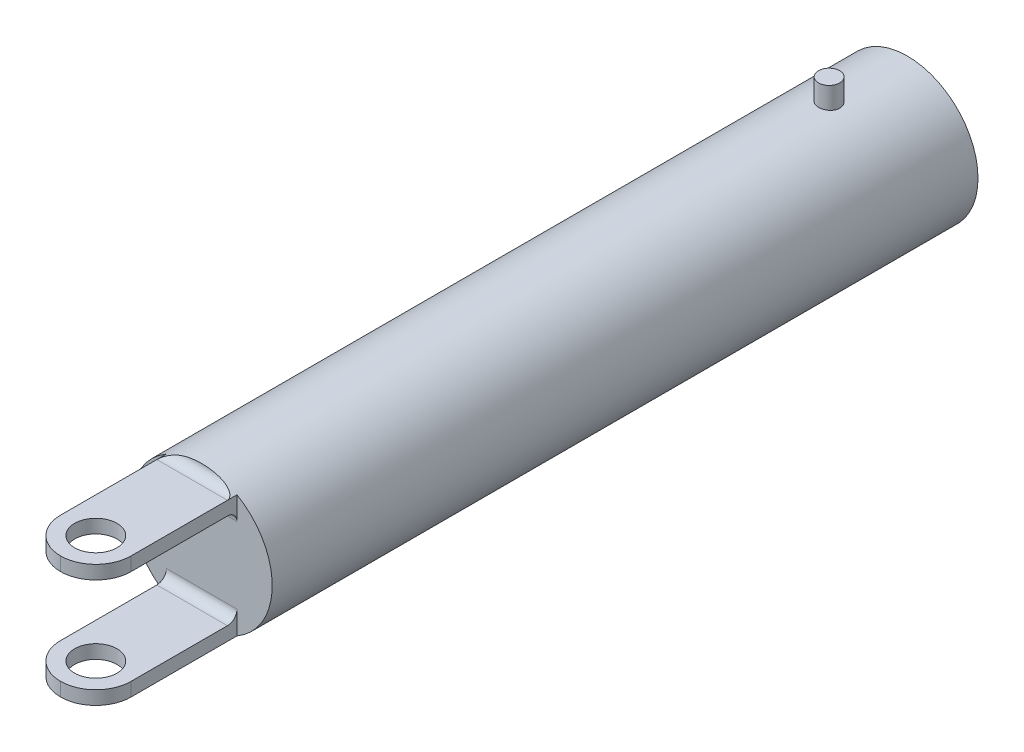
ISO-10303-21;
HEADER;
FILE_DESCRIPTION(('STEP AP214'),'2;1');
FILE_NAME('part.step','',(''),(''),'','','');
FILE_SCHEMA(('AUTOMOTIVE_DESIGN { 1 0 10303 214 1 1 1 1 }'));
ENDSEC;
DATA;
#1=APPLICATION_CONTEXT('core data for automotive mechanical design processes');
#2=APPLICATION_PROTOCOL_DEFINITION('international standard','automotive_design',2000,#1);
#3=PRODUCT_CONTEXT('',#1,'mechanical');
#4=PRODUCT('Part','Part','',(#3));
#5=PRODUCT_RELATED_PRODUCT_CATEGORY('part','',(#4));
#6=PRODUCT_DEFINITION_FORMATION('','',#4);
#7=PRODUCT_DEFINITION_CONTEXT('part definition',#1,'design');
#8=PRODUCT_DEFINITION('design','',#6,#7);
#9=PRODUCT_DEFINITION_SHAPE('','',#8);
#10=(LENGTH_UNIT() NAMED_UNIT(*) SI_UNIT(.MILLI.,.METRE.));
#11=(NAMED_UNIT(*) PLANE_ANGLE_UNIT() SI_UNIT($,.RADIAN.));
#12=(NAMED_UNIT(*) SI_UNIT($,.STERADIAN.) SOLID_ANGLE_UNIT());
#13=UNCERTAINTY_MEASURE_WITH_UNIT(LENGTH_MEASURE(1.E-05),#10,'distance_accuracy_value','');
#14=(GEOMETRIC_REPRESENTATION_CONTEXT(3) GLOBAL_UNCERTAINTY_ASSIGNED_CONTEXT((#13)) GLOBAL_UNIT_ASSIGNED_CONTEXT((#10,
#11,#12)) REPRESENTATION_CONTEXT('',''));
#15=CARTESIAN_POINT('',(0.,0.,0.));
#16=DIRECTION('',(0.,0.,1.));
#17=DIRECTION('',(1.,0.,0.));
#18=AXIS2_PLACEMENT_3D('',#15,#16,#17);
#19=CARTESIAN_POINT('',(0.,0.,100.));
#20=DIRECTION('',(0.,0.,-1.));
#21=DIRECTION('',(-1.,0.,0.));
#22=AXIS2_PLACEMENT_3D('',#19,#20,#21);
#23=CYLINDRICAL_SURFACE('',#22,10.);
#24=DIRECTION('',(0.,0.,-1.));
#25=VECTOR('',#24,1.);
#26=CARTESIAN_POINT('',(-5.,8.66025403784439,100.));
#27=LINE('',#26,#25);
#28=CARTESIAN_POINT('',(-5.,8.66025403784439,100.));
#29=VERTEX_POINT('',#28);
#30=CARTESIAN_POINT('',(-5.,8.66025403784439,101.349997206585));
#31=VERTEX_POINT('',#30);
#32=EDGE_CURVE('E157',#29,#31,#27,.F.);
#33=ORIENTED_EDGE('',*,*,#32,.T.);
#34=CARTESIAN_POINT('',(-5.,8.66025403784439,101.349997206585));
#35=CARTESIAN_POINT('',(-5.00000322632328,8.66025170389989,101.329827622163));
#36=CARTESIAN_POINT('',(-4.99921630531021,8.66070654381186,101.309669164745));
#37=CARTESIAN_POINT('',(-4.99609899344871,8.66250540092606,101.26952692879));
#38=CARTESIAN_POINT('',(-4.99376977917503,8.66384874031466,101.249543028853));
#39=CARTESIAN_POINT('',(-4.98457738362717,8.66914298553422,101.190391557313));
#40=CARTESIAN_POINT('',(-4.97550796550232,8.67435910604963,101.15165732319));
#41=CARTESIAN_POINT('',(-4.95217791601018,8.68769875191493,101.076492680684));
#42=CARTESIAN_POINT('',(-4.93793159916969,8.69581425920313,101.040056241635));
#43=CARTESIAN_POINT('',(-4.90507469517524,8.71439042359052,100.969787104656));
#44=CARTESIAN_POINT('',(-4.8864546282227,8.72485617247661,100.935960277488));
#45=CARTESIAN_POINT('',(-4.83258336955585,8.75486101460536,100.850326606991));
#46=CARTESIAN_POINT('',(-4.79433505467011,8.77590826899368,100.800938145213));
#47=CARTESIAN_POINT('',(-4.71127572785958,8.82077788856843,100.709487400177));
#48=CARTESIAN_POINT('',(-4.66644692309337,8.84460774065697,100.667445678891));
#49=CARTESIAN_POINT('',(-4.57909571585626,8.89010395255393,100.595480674627));
#50=CARTESIAN_POINT('',(-4.53718150540707,8.91158295404886,100.564684145941));
#51=CARTESIAN_POINT('',(-4.45083022919407,8.9550240286029,100.507215710059));
#52=CARTESIAN_POINT('',(-4.40639128049029,8.97698645451788,100.480546938028));
#53=CARTESIAN_POINT('',(-4.27010459360689,9.04302810151417,100.405849350671));
#54=CARTESIAN_POINT('',(-4.17536865533593,9.08721876352218,100.363192189202));
#55=CARTESIAN_POINT('',(-3.97862030759323,9.17510515934806,100.287712902691));
#56=CARTESIAN_POINT('',(-3.87648110773209,9.21875611761895,100.255184028531));
#57=CARTESIAN_POINT('',(-3.66870086784599,9.30339896701409,100.198721958584));
#58=CARTESIAN_POINT('',(-3.5630562650844,9.34438801932064,100.174797819939));
#59=CARTESIAN_POINT('',(-3.34906202907786,9.42320694720929,100.133506393297));
#60=CARTESIAN_POINT('',(-3.24070620345464,9.46102852910241,100.116155923836));
#61=CARTESIAN_POINT('',(-3.0221820930741,9.53308187872608,100.086543968234));
#62=CARTESIAN_POINT('',(-2.91201441687829,9.56731482442202,100.074280808254));
#63=CARTESIAN_POINT('',(-2.68805481226179,9.63266512058817,100.053417888113));
#64=CARTESIAN_POINT('',(-2.57423422062167,9.66370793618773,100.044894937401));
#65=CARTESIAN_POINT('',(-2.34537974992472,9.7217865992058,100.03084177486));
#66=CARTESIAN_POINT('',(-2.23034566840783,9.7488217662848,100.025312070744));
#67=CARTESIAN_POINT('',(-1.99923774707741,9.79882832624992,100.016416812987));
#68=CARTESIAN_POINT('',(-1.88316325853925,9.82179696701457,100.013052720948));
#69=CARTESIAN_POINT('',(-1.65023054991217,9.86360697079273,100.007823314633));
#70=CARTESIAN_POINT('',(-1.53337225377361,9.88244792716465,100.005958147975));
#71=CARTESIAN_POINT('',(-1.298976146924,9.91598136767719,100.003190496941));
#72=CARTESIAN_POINT('',(-1.18143795233718,9.93067121383505,100.002288623719));
#73=CARTESIAN_POINT('',(-0.945903148264361,9.95586744531411,100.00103709202));
#74=CARTESIAN_POINT('',(-0.827906505405094,9.9663735200847,100.00068747453));
#75=CARTESIAN_POINT('',(-0.59166860717847,9.98318302896623,100.000244930657));
#76=CARTESIAN_POINT('',(-0.47342749344109,9.98948844302972,100.000151883276));
#77=CARTESIAN_POINT('',(-0.236793892420284,9.99789721851771,100.000051290055));
#78=CARTESIAN_POINT('',(-0.118401396835088,10.0000003386472,100.000043749125));
#79=CARTESIAN_POINT('',(0.228261228487549,9.9999993471359,100.000029678236));
#80=CARTESIAN_POINT('',(0.456555539728071,9.99218089250884,100.000030578477));
#81=CARTESIAN_POINT('',(0.912153496618534,9.96093003230051,100.00081073322));
#82=CARTESIAN_POINT('',(1.1394567857866,9.93749241072995,100.001590247782));
#83=CARTESIAN_POINT('',(1.47838926976518,9.89076973989951,100.005212274155));
#84=CARTESIAN_POINT('',(1.59085860632886,9.87330344062312,100.006824063952));
#85=CARTESIAN_POINT('',(1.81510710490332,9.83454772520989,100.01133968898));
#86=CARTESIAN_POINT('',(1.92688632747234,9.81325864960344,100.014243409161));
#87=CARTESIAN_POINT('',(2.14952618679791,9.76690633994278,100.021906375884));
#88=CARTESIAN_POINT('',(2.26038733778618,9.74184539414281,100.02666450019));
#89=CARTESIAN_POINT('',(2.48104977306955,9.68799696561515,100.038736097327));
#90=CARTESIAN_POINT('',(2.59085123584455,9.65921012262854,100.046049131841));
#91=CARTESIAN_POINT('',(2.76831570904148,9.60944650322261,100.060716779289));
#92=CARTESIAN_POINT('',(2.83637572663117,9.58957678608952,100.067032347253));
#93=CARTESIAN_POINT('',(2.97189783523708,9.54844709909772,100.081258097608));
#94=CARTESIAN_POINT('',(3.03935996149564,9.52718721180899,100.089168185349));
#95=CARTESIAN_POINT('',(3.24104770007883,9.46126920139635,100.115746151772));
#96=CARTESIAN_POINT('',(3.37427557592422,9.41455668152037,100.137239464049));
#97=CARTESIAN_POINT('',(3.5837416810091,9.33615479433167,100.179875648906));
#98=CARTESIAN_POINT('',(3.66125418820969,9.30602237524095,100.197650495581));
#99=CARTESIAN_POINT('',(3.81454576555553,9.24424487471702,100.237754194264));
#100=CARTESIAN_POINT('',(3.89032406113805,9.21259913614962,100.260085038642));
#101=CARTESIAN_POINT('',(4.03922755804903,9.14828894777299,100.310205707958));
#102=CARTESIAN_POINT('',(4.11236244997222,9.1156292613612,100.337972534387));
#103=CARTESIAN_POINT('',(4.25538145986475,9.04974609703672,100.400272486837));
#104=CARTESIAN_POINT('',(4.3252694523891,9.01652335921978,100.434797277789));
#105=CARTESIAN_POINT('',(4.44330527248478,8.95880572554081,100.502417369838));
#106=CARTESIAN_POINT('',(4.49247164533667,8.93423413527631,100.533654731326));
#107=CARTESIAN_POINT('',(4.58739645572578,8.88586674151323,100.601670169894));
#108=CARTESIAN_POINT('',(4.63315097957994,8.86207184601393,100.638454467995));
#109=CARTESIAN_POINT('',(4.720250610332,8.81599023375855,100.718806891295));
#110=CARTESIAN_POINT('',(4.76154564085501,8.79372150294794,100.762440768105));
#111=CARTESIAN_POINT('',(4.83694946289106,8.75247158193252,100.856927282051));
#112=CARTESIAN_POINT('',(4.8710764017183,8.73348211193027,100.907761130609));
#113=CARTESIAN_POINT('',(4.91921572018653,8.70642328368792,100.997969442383));
#114=CARTESIAN_POINT('',(4.93611898062109,8.69683819791175,101.035341505438));
#115=CARTESIAN_POINT('',(4.96445658787612,8.68069337039044,101.112684560176));
#116=CARTESIAN_POINT('',(4.97590457320504,8.67412608545011,101.15264878377));
#117=CARTESIAN_POINT('',(4.9893914259472,8.66637238086317,101.219050765991));
#118=CARTESIAN_POINT('',(4.99334660041027,8.6640929016553,101.244983870534));
#119=CARTESIAN_POINT('',(4.99866073431253,8.66102728228012,101.297269027792));
#120=CARTESIAN_POINT('',(5.0000128606752,8.66024507251903,101.32362200055));
#121=CARTESIAN_POINT('',(4.99999999999499,8.66025403784728,101.349997206586));
#122=B_SPLINE_CURVE_WITH_KNOTS('',3,(#34,#35,#36,#37,#38,#39,#40,#41,#42,#43,#44,#45,#46,#47,
#48,#49,#50,#51,#52,#53,#54,#55,#56,#57,#58,#59,#60,#61,#62,#63,#64,#65,#66,#67,#68,#69,#70,#71,
#72,#73,#74,#75,#76,#77,#78,#79,#80,#81,#82,#83,#84,#85,#86,#87,#88,#89,#90,#91,#92,#93,#94,#95,
#96,#97,#98,#99,#100,#101,#102,#103,#104,#105,#106,#107,#108,#109,#110,#111,#112,#113,#114,#115,
#116,#117,#118,#119,#120,#121),.UNSPECIFIED.,.F.,.F.,(4,2,2,2,2,2,2,2,2,2,2,2,2,2,2,2,2,2,2,2,2,
2,2,2,2,2,2,2,2,2,2,2,2,2,2,2,2,2,2,2,2,2,2,4),(0.,0.0604673524521366,0.120888629023738,
0.240645853782746,0.360074429318375,0.479764286181171,0.676385935540369,0.873549367830131,
1.04212235589433,1.21082275887412,1.54855498940125,1.89531151633351,2.2424319702139,
2.59043461876239,2.93832267580633,3.29305416502493,3.64784580476702,4.00287664816593,
4.35794245195437,4.71323339113064,5.06855069772757,5.42370040923775,5.77887051279908,
6.46358848343145,7.14853522890957,7.48996210656597,7.83135858521548,8.17254877989685,
8.51368046933098,8.72719322341972,8.94069330729183,9.36862630090742,9.6236353619091,
9.87875618016008,10.1328200935898,10.3865726046116,10.5759724257937,10.7655862653081,
10.9571462266138,11.1482152128891,11.2741375801848,11.3997434607067,11.4785767994894,
11.5576167973951),.UNSPECIFIED.);
#123=CARTESIAN_POINT('',(5.,8.66025403784439,101.35));
#124=VERTEX_POINT('',#123);
#125=EDGE_CURVE('E151',#31,#124,#122,.T.);
#126=ORIENTED_EDGE('',*,*,#125,.T.);
#127=DIRECTION('',(0.,0.,-1.));
#128=VECTOR('',#127,1.);
#129=CARTESIAN_POINT('',(5.,8.66025403784439,100.));
#130=LINE('',#129,#128);
#131=CARTESIAN_POINT('',(5.,8.66025403784439,100.));
#132=VERTEX_POINT('',#131);
#133=EDGE_CURVE('E145',#132,#124,#130,.F.);
#134=ORIENTED_EDGE('',*,*,#133,.F.);
#135=CARTESIAN_POINT('',(0.,0.,100.));
#136=DIRECTION('',(0.,0.,1.));
#137=DIRECTION('',(1.,0.,0.));
#138=AXIS2_PLACEMENT_3D('',#135,#136,#137);
#139=CIRCLE('',#138,10.);
#140=CARTESIAN_POINT('',(5.00000000000001,-8.66025403784438,100.));
#141=VERTEX_POINT('',#140);
#142=EDGE_CURVE('E150',#141,#132,#139,.T.);
#143=ORIENTED_EDGE('',*,*,#142,.F.);
#144=DIRECTION('',(0.,0.,-1.));
#145=VECTOR('',#144,1.);
#146=CARTESIAN_POINT('',(5.00000000000001,-8.66025403784438,100.));
#147=LINE('',#146,#145);
#148=CARTESIAN_POINT('',(5.00000000000001,-8.66025403784438,101.349997209955));
#149=VERTEX_POINT('',#148);
#150=EDGE_CURVE('E56',#141,#149,#147,.F.);
#151=ORIENTED_EDGE('',*,*,#150,.T.);
#152=CARTESIAN_POINT('',(5.00000000000001,-8.66025403784438,101.349997209955));
#153=CARTESIAN_POINT('',(5.00000322641048,-8.66025170384954,101.329827625578));
#154=CARTESIAN_POINT('',(4.99921630548799,-8.66070654370922,101.309669168198));
#155=CARTESIAN_POINT('',(4.99609899381222,-8.66250540071639,101.26952693231));
#156=CARTESIAN_POINT('',(4.99376977963367,-8.66384874005026,101.249543032402));
#157=CARTESIAN_POINT('',(4.98457738437295,-8.66914298510523,101.190391560931));
#158=CARTESIAN_POINT('',(4.97550796644356,-8.67435910550941,101.151657326834));
#159=CARTESIAN_POINT('',(4.95217791733596,-8.68769875115887,101.076492684343));
#160=CARTESIAN_POINT('',(4.9379316006842,-8.69581425834267,101.040056245285));
#161=CARTESIAN_POINT('',(4.90507469705543,-8.71439042253175,100.969787108265));
#162=CARTESIAN_POINT('',(4.88645463027993,-8.72485617132391,100.935960281066));
#163=CARTESIAN_POINT('',(4.83258337220305,-8.75486101314208,100.850326610693));
#164=CARTESIAN_POINT('',(4.79433505775819,-8.775908267304,100.800938149027));
#165=CARTESIAN_POINT('',(4.71127573184103,-8.8207778864392,100.709487404145));
#166=CARTESIAN_POINT('',(4.66644692752738,-8.8446077383146,100.6674456829));
#167=CARTESIAN_POINT('',(4.57909572123033,-8.89010394978313,100.595480678751));
#168=CARTESIAN_POINT('',(4.53718151127662,-8.91158295105755,100.564684150133));
#169=CARTESIAN_POINT('',(4.45083023606427,-8.95502402518533,100.507215714345));
#170=CARTESIAN_POINT('',(4.40639128786568,-8.97698645089456,100.480546942339));
#171=CARTESIAN_POINT('',(4.2701046025076,-9.04302809729916,100.405849355009));
#172=CARTESIAN_POINT('',(4.17536866526458,-9.0872187589477,100.363192193492));
#173=CARTESIAN_POINT('',(3.97862031985202,-9.17510515401596,100.287712906901));
#174=CARTESIAN_POINT('',(3.87648112130517,-9.21875611189501,100.25518403268));
#175=CARTESIAN_POINT('',(3.66870088406571,-9.30339896060164,100.198721962531));
#176=CARTESIAN_POINT('',(3.56305628263651,-9.34438801261162,100.174797823746));
#177=CARTESIAN_POINT('',(3.34906204930561,-9.42320694000396,100.133506396779));
#178=CARTESIAN_POINT('',(3.24070622502559,-9.46102852169753,100.116155927135));
#179=CARTESIAN_POINT('',(3.02218211733791,-9.53308187101796,100.086543971147));
#180=CARTESIAN_POINT('',(2.91201444249174,-9.56731481661019,100.074280810966));
#181=CARTESIAN_POINT('',(2.68805483823295,-9.63266511335458,100.053417890199));
#182=CARTESIAN_POINT('',(2.5742342455695,-9.66370792955613,100.044894939147));
#183=CARTESIAN_POINT('',(2.34537977278312,-9.72178659370524,100.030841776049));
#184=CARTESIAN_POINT('',(2.2303456902001,-9.74882176131321,100.025312071715));
#185=CARTESIAN_POINT('',(1.999237766701,-9.79882832226023,100.016416813609));
#186=CARTESIAN_POINT('',(1.88316327706024,-9.82179696347757,100.01305272144));
#187=CARTESIAN_POINT('',(1.65023056620343,-9.86360696808117,100.007823314923));
#188=CARTESIAN_POINT('',(1.53337226893775,-9.8824479248258,100.005958148193));
#189=CARTESIAN_POINT('',(1.2989761598056,-9.91598136600384,100.003190497054));
#190=CARTESIAN_POINT('',(1.1814379640633,-9.93067121245411,100.002288623798));
#191=CARTESIAN_POINT('',(0.945903157665656,-9.95586744443496,100.001037092053));
#192=CARTESIAN_POINT('',(0.827906513637044,-9.96637351941493,100.000687474551));
#193=CARTESIAN_POINT('',(0.591668613066224,-9.98318302863126,100.000244930662));
#194=CARTESIAN_POINT('',(0.473427498154004,-9.98948844282034,100.000151883279));
#195=CARTESIAN_POINT('',(0.236793894779031,-9.99789721847581,100.000051290055));
#196=CARTESIAN_POINT('',(0.118401398014507,-10.0000003386472,100.000043749125));
#197=CARTESIAN_POINT('',(-0.228261228493907,-9.9999993471359,100.000029678236));
#198=CARTESIAN_POINT('',(-0.456555539740421,-9.99218089250843,100.000030578477));
#199=CARTESIAN_POINT('',(-0.912153496642823,-9.96093003229842,100.00081073322));
#200=CARTESIAN_POINT('',(-1.13945678581684,-9.93749241072662,100.001590247783));
#201=CARTESIAN_POINT('',(-1.47838926979817,-9.89076973989455,100.005212274155));
#202=CARTESIAN_POINT('',(-1.59085860635877,-9.87330344061827,100.006824063952));
#203=CARTESIAN_POINT('',(-1.81510710492711,-9.83454772520546,100.011339688981));
#204=CARTESIAN_POINT('',(-1.92688632749308,-9.81325864959933,100.014243409162));
#205=CARTESIAN_POINT('',(-2.14952618681262,-9.76690633993951,100.021906375885));
#206=CARTESIAN_POINT('',(-2.2603873377979,-9.74184539414006,100.026664500191));
#207=CARTESIAN_POINT('',(-2.48104977307536,-9.68799696561363,100.038736097327));
#208=CARTESIAN_POINT('',(-2.59085123584743,-9.65921012262773,100.046049131841));
#209=CARTESIAN_POINT('',(-2.76831570904793,-9.6094465032208,100.06071677929));
#210=CARTESIAN_POINT('',(-2.83637572664403,-9.58957678608576,100.067032347254));
#211=CARTESIAN_POINT('',(-2.97189783526264,-9.54844709908981,100.081258097611));
#212=CARTESIAN_POINT('',(-3.03935996152748,-9.52718721179888,100.089168185353));
#213=CARTESIAN_POINT('',(-3.24104770013055,-9.46126920137885,100.11574615178));
#214=CARTESIAN_POINT('',(-3.37427557598928,-9.41455668149726,100.13723946406));
#215=CARTESIAN_POINT('',(-3.58374168108646,-9.33615479430198,100.179875648923));
#216=CARTESIAN_POINT('',(-3.66125418828649,-9.30602237521073,100.1976504956));
#217=CARTESIAN_POINT('',(-3.81454576563109,-9.24424487468584,100.237754194285));
#218=CARTESIAN_POINT('',(-3.89032406121291,-9.212599136118,100.260085038665));
#219=CARTESIAN_POINT('',(-4.03922755812209,-9.14828894774072,100.310205707985));
#220=CARTESIAN_POINT('',(-4.11236245004418,-9.11562926132873,100.337972534416));
#221=CARTESIAN_POINT('',(-4.25538145993414,-9.04974609700408,100.40027248687));
#222=CARTESIAN_POINT('',(-4.32526945245704,-9.01652335918718,100.434797277825));
#223=CARTESIAN_POINT('',(-4.44330527257362,-8.9588057254969,100.502417369892));
#224=CARTESIAN_POINT('',(-4.49247164544675,-8.93423413522109,100.533654731398));
#225=CARTESIAN_POINT('',(-4.58739645587425,-8.88586674143671,100.601670170007));
#226=CARTESIAN_POINT('',(-4.63315097974555,-8.86207184592745,100.638454468133));
#227=CARTESIAN_POINT('',(-4.72025061052614,-8.8159902336547,100.718806891489));
#228=CARTESIAN_POINT('',(-4.76154564106038,-8.79372150283677,100.762440768332));
#229=CARTESIAN_POINT('',(-4.83694946310689,-8.75247158181328,100.856927282352));
#230=CARTESIAN_POINT('',(-4.87107640193342,-8.73348211181025,100.90776113095));
#231=CARTESIAN_POINT('',(-4.9192157203801,-8.70642328357852,100.997969442787));
#232=CARTESIAN_POINT('',(-4.93611898080019,-8.69683819781005,101.035341505861));
#233=CARTESIAN_POINT('',(-4.96445658801999,-8.68069337030813,101.112684560635));
#234=CARTESIAN_POINT('',(-4.97590457332821,-8.67412608537944,101.152648784246));
#235=CARTESIAN_POINT('',(-4.98939142596046,-8.66637238085546,101.219050766138));
#236=CARTESIAN_POINT('',(-4.99334660037035,-8.66409290167827,101.244983870327));
#237=CARTESIAN_POINT('',(-4.9986607342373,-8.66102728232356,101.297269026864));
#238=CARTESIAN_POINT('',(-5.00001286061829,-8.66024507255198,101.323621999257));
#239=CARTESIAN_POINT('',(-4.99999999999498,-8.66025403784728,101.349997204932));
#240=B_SPLINE_CURVE_WITH_KNOTS('',3,(#152,#153,#154,#155,#156,#157,#158,#159,#160,#161,#162,
#163,#164,#165,#166,#167,#168,#169,#170,#171,#172,#173,#174,#175,#176,#177,#178,#179,#180,#181,
#182,#183,#184,#185,#186,#187,#188,#189,#190,#191,#192,#193,#194,#195,#196,#197,#198,#199,#200,
#201,#202,#203,#204,#205,#206,#207,#208,#209,#210,#211,#212,#213,#214,#215,#216,#217,#218,#219,
#220,#221,#222,#223,#224,#225,#226,#227,#228,#229,#230,#231,#232,#233,#234,#235,#236,#237,#238,
#239),.UNSPECIFIED.,.F.,.F.,(4,2,2,2,2,2,2,2,2,2,2,2,2,2,2,2,2,2,2,2,2,2,2,2,2,2,2,2,2,2,2,2,2,
2,2,2,2,2,2,2,2,2,2,4),(0.,0.0604673523218793,0.120888628764396,0.240645853273889,
0.360074428569536,0.479764285188988,0.676385933320393,0.873549364377754,1.04212235097214,
1.21082275248022,1.54855498005726,1.89531150312396,2.24243195313334,2.59043459780945,
2.93832265098241,3.29305414369601,3.64784578693754,4.0028766338515,4.35794244115651,
4.71323338387953,5.06855069402419,5.42370040907169,5.77887051617055,6.46358848682137,
7.14853523231743,7.48996210996469,7.83135858860503,8.17254878327734,8.51368047270243,
8.72719322681135,8.94069331070365,9.36862630436347,9.62363536536504,9.87875618361592,
10.1328200970449,10.3865726080659,10.575972429337,10.7655862689409,10.9571462303413,
11.1482152167101,11.2741375840329,11.3997434645808,11.4785768022914,11.5576167991134),.UNSPECIFIED.);
#241=CARTESIAN_POINT('',(-4.99999999999999,-8.66025403784439,101.35));
#242=VERTEX_POINT('',#241);
#243=EDGE_CURVE('E271',#149,#242,#240,.T.);
#244=ORIENTED_EDGE('',*,*,#243,.T.);
#245=DIRECTION('',(0.,0.,-1.));
#246=VECTOR('',#245,1.);
#247=CARTESIAN_POINT('',(-4.99999999999999,-8.66025403784439,100.));
#248=LINE('',#247,#246);
#249=CARTESIAN_POINT('',(-4.99999999999999,-8.66025403784439,100.));
#250=VERTEX_POINT('',#249);
#251=EDGE_CURVE('E156',#250,#242,#248,.F.);
#252=ORIENTED_EDGE('',*,*,#251,.F.);
#253=EDGE_CURVE('E167',#29,#250,#139,.T.);
#254=ORIENTED_EDGE('',*,*,#253,.F.);
#255=EDGE_LOOP('',(#33,#126,#134,#143,#151,#244,#252,#254));
#256=FACE_BOUND('',#255,.T.);
#257=CARTESIAN_POINT('',(0.,0.,0.));
#258=DIRECTION('',(0.,0.,1.));
#259=DIRECTION('',(1.,0.,0.));
#260=AXIS2_PLACEMENT_3D('',#257,#258,#259);
#261=CIRCLE('',#260,10.);
#262=CARTESIAN_POINT('',(10.,0.,0.));
#263=VERTEX_POINT('',#262);
#264=EDGE_CURVE('E168',#263,#263,#261,.T.);
#265=ORIENTED_EDGE('',*,*,#264,.T.);
#266=EDGE_LOOP('',(#265));
#267=FACE_BOUND('',#266,.T.);
#268=CARTESIAN_POINT('',(0.,10.,9.59849510720843));
#269=CARTESIAN_POINT('',(-0.083751544481642,9.99999865771297,9.59849856102367));
#270=CARTESIAN_POINT('',(-0.167551685082132,9.9989368253704,9.60553310804906));
#271=CARTESIAN_POINT('',(-0.332809627994913,9.99480315973187,9.63347830719118));
#272=CARTESIAN_POINT('',(-0.414265068974229,9.99172936938473,9.65440247015332));
#273=CARTESIAN_POINT('',(-0.572418086221859,9.98391721219526,9.70948761217605));
#274=CARTESIAN_POINT('',(-0.649119207826798,9.97918010370919,9.74363858671438));
#275=CARTESIAN_POINT('',(-0.795690428635253,9.96856475911724,9.82418348662529));
#276=CARTESIAN_POINT('',(-0.865561474725188,9.96268668152773,9.87057571162579));
#277=CARTESIAN_POINT('',(-0.997046719562125,9.95039170991452,9.9746723721483));
#278=CARTESIAN_POINT('',(-1.0585998322255,9.94397133890331,10.0324535634166));
#279=CARTESIAN_POINT('',(-1.17117490668948,9.93134261133238,10.1575227961023));
#280=CARTESIAN_POINT('',(-1.22219626272936,9.92513426698505,10.2248113839869));
#281=CARTESIAN_POINT('',(-1.31249729499943,9.91359877458726,10.3673957507309));
#282=CARTESIAN_POINT('',(-1.35171787037205,9.90827611975031,10.4427293541898));
#283=CARTESIAN_POINT('',(-1.41692632171056,9.89916211306268,10.5990079278539));
#284=CARTESIAN_POINT('',(-1.44291491889163,9.89537067775449,10.6799525919523));
#285=CARTESIAN_POINT('',(-1.48073198798911,9.88978256218673,10.8445131490801));
#286=CARTESIAN_POINT('',(-1.49266503640518,9.8879711574125,10.9281045006165));
#287=CARTESIAN_POINT('',(-1.50235624033932,9.88650348970582,11.0961212731957));
#288=CARTESIAN_POINT('',(-1.50011520973796,9.88684710303147,11.1805466460709));
#289=CARTESIAN_POINT('',(-1.48160733250788,9.88963718352409,11.3470961874026));
#290=CARTESIAN_POINT('',(-1.4654569592775,9.89206618761549,11.4292336336932));
#291=CARTESIAN_POINT('',(-1.41977117403734,9.89872608126367,11.58961947608));
#292=CARTESIAN_POINT('',(-1.39023538337812,9.90295702179379,11.6678677620892));
#293=CARTESIAN_POINT('',(-1.31849603529736,9.91276335545481,11.8186084784913));
#294=CARTESIAN_POINT('',(-1.27624314283198,9.91834396766526,11.8910770763008));
#295=CARTESIAN_POINT('',(-1.18030413128955,9.93021707574548,12.0279397029904));
#296=CARTESIAN_POINT('',(-1.12661726182478,9.93650961832501,12.0923332014778));
#297=CARTESIAN_POINT('',(-1.00869493078248,9.94917473056209,12.2118927679481));
#298=CARTESIAN_POINT('',(-0.944359329642002,9.95554747112815,12.2669600974948));
#299=CARTESIAN_POINT('',(-0.807307089894187,9.96759647648462,12.3655310417157));
#300=CARTESIAN_POINT('',(-0.734590414588171,9.9732727382251,12.4090346057523));
#301=CARTESIAN_POINT('',(-0.582754598213686,9.98329515585393,12.483248193708));
#302=CARTESIAN_POINT('',(-0.50363167783678,9.98764051925428,12.5139505990487));
#303=CARTESIAN_POINT('',(-0.341273182487061,9.99450490557069,12.5616044968938));
#304=CARTESIAN_POINT('',(-0.258037885952601,9.99702405195467,12.578556919024));
#305=CARTESIAN_POINT('',(-0.0906695676436471,9.99993581133871,12.5980983370251));
#306=CARTESIAN_POINT('',(-0.00655273187047137,10.0003485209039,12.6008230785878));
#307=CARTESIAN_POINT('',(0.160936677662282,9.99905561015226,12.5921921018974));
#308=CARTESIAN_POINT('',(0.244309274381876,9.99735005541369,12.5808368195403));
#309=CARTESIAN_POINT('',(0.407532387431407,9.99202468615333,12.5444810070309));
#310=CARTESIAN_POINT('',(0.487397963079837,9.98841415207984,12.5195466111776));
#311=CARTESIAN_POINT('',(0.641814958642999,9.97968235658369,12.4568101097467));
#312=CARTESIAN_POINT('',(0.716366128795099,9.97456102421565,12.4190073998748));
#313=CARTESIAN_POINT('',(0.85863497929192,9.96332682468686,12.3312888826446));
#314=CARTESIAN_POINT('',(0.926299009891565,9.95720701626745,12.2812869671957));
#315=CARTESIAN_POINT('',(1.05232367317771,9.94467863012165,12.1707092955797));
#316=CARTESIAN_POINT('',(1.1106837647934,9.93827003562867,12.1101329248838));
#317=CARTESIAN_POINT('',(1.21693784957195,9.92582264304494,11.9795215740319));
#318=CARTESIAN_POINT('',(1.26474084747421,9.91978736017588,11.9094121820137));
#319=CARTESIAN_POINT('',(1.34789129270584,9.90883219104903,11.7620790666967));
#320=CARTESIAN_POINT('',(1.38323907656436,9.90391227465628,11.684855535687));
#321=CARTESIAN_POINT('',(1.44033467323943,9.89577033008645,11.5257575735853));
#322=CARTESIAN_POINT('',(1.46213037141635,9.89254233006438,11.4439006462372));
#323=CARTESIAN_POINT('',(1.49165549501586,9.88813382297802,11.2776360917733));
#324=CARTESIAN_POINT('',(1.49938589183066,9.88695317451771,11.1932286412138));
#325=CARTESIAN_POINT('',(1.5005378666944,9.88677832610841,11.0251660438926));
#326=CARTESIAN_POINT('',(1.49410252167313,9.88776226333502,10.9415118654515));
#327=CARTESIAN_POINT('',(1.46741229544379,9.89175820611174,10.7764898438849));
#328=CARTESIAN_POINT('',(1.44715743638627,9.89477020841118,10.695121997095));
#329=CARTESIAN_POINT('',(1.39345373518665,9.90247526112297,10.5370220249741));
#330=CARTESIAN_POINT('',(1.36001489324314,9.90716703716075,10.460286436775));
#331=CARTESIAN_POINT('',(1.28090667642309,9.91770454557702,10.313491473406));
#332=CARTESIAN_POINT('',(1.23523688741502,9.92355031702724,10.2434323244048));
#333=CARTESIAN_POINT('',(1.13244337659164,9.93580743364938,10.1112520492333));
#334=CARTESIAN_POINT('',(1.07521369039806,9.94222367881967,10.0492137739614));
#335=CARTESIAN_POINT('',(0.951148841082835,9.95485788826636,9.93557055242061));
#336=CARTESIAN_POINT('',(0.884311448350941,9.96107580610759,9.88396803463227));
#337=CARTESIAN_POINT('',(0.742495707543722,9.9726518579052,9.79240743060107));
#338=CARTESIAN_POINT('',(0.667474576764761,9.9780050712882,9.75251499799368));
#339=CARTESIAN_POINT('',(0.51175187024872,9.98720028802959,9.68595659045038));
#340=CARTESIAN_POINT('',(0.431056277096706,9.99104385565757,9.65927691715474));
#341=CARTESIAN_POINT('',(0.291665727889331,9.99590939261505,9.62595376449832));
#342=CARTESIAN_POINT('',(0.23383113349528,9.99743549179557,9.61567250566962));
#343=CARTESIAN_POINT('',(0.117338971600126,9.99948125947896,9.60194200949579));
#344=CARTESIAN_POINT('',(0.0586814143344178,10.0000009404877,9.59849268725588));
#345=CARTESIAN_POINT('',(0.,10.,9.59849510720843));
#346=B_SPLINE_CURVE_WITH_KNOTS('',3,(#268,#269,#270,#271,#272,#273,#274,#275,#276,#277,#278,
#279,#280,#281,#282,#283,#284,#285,#286,#287,#288,#289,#290,#291,#292,#293,#294,#295,#296,#297,
#298,#299,#300,#301,#302,#303,#304,#305,#306,#307,#308,#309,#310,#311,#312,#313,#314,#315,#316,
#317,#318,#319,#320,#321,#322,#323,#324,#325,#326,#327,#328,#329,#330,#331,#332,#333,#334,#335,
#336,#337,#338,#339,#340,#341,#342,#343,#344,#345),.UNSPECIFIED.,.T.,.F.,(4,2,2,2,2,2,2,2,2,2,2,
2,2,2,2,2,2,2,2,2,2,2,2,2,2,2,2,2,2,2,2,2,2,2,2,2,2,2,4),(0.,0.251040205031663,0.50232496292915,
0.753420023583236,1.0044802241976,1.25729416136843,1.5101226357258,1.76419702395375,
2.01825756225506,2.27041564605924,2.52255925098982,2.77261177195746,3.02267136690361,
3.27371383476159,3.52477278308534,3.77834291255408,4.03191415238668,4.28563608984874,
4.53934087193401,4.79062058544255,5.04189251991155,5.29195148965948,5.54202220376273,
5.79391188036907,6.04581620028629,6.29981366584671,6.55380426808832,6.80689223457167,
7.05996272137176,7.31048888261064,7.56101464229563,7.81135073984146,8.06169531466879,
8.3144482996572,8.56726003468733,8.82146323384733,9.07540233261441,9.25129851978808,
9.4271925212329),.UNSPECIFIED.);
#347=CARTESIAN_POINT('',(0.,10.,9.59849510720843));
#348=VERTEX_POINT('',#347);
#349=EDGE_CURVE('E11',#348,#348,#346,.T.);
#350=ORIENTED_EDGE('',*,*,#349,.F.);
#351=EDGE_LOOP('',(#350));
#352=FACE_BOUND('',#351,.T.);
#353=ADVANCED_FACE('F41',(#256,#267,#352),#23,.T.);
#354=CARTESIAN_POINT('',(0.,0.,100.));
#355=DIRECTION('',(0.,0.,1.));
#356=DIRECTION('',(1.,0.,0.));
#357=AXIS2_PLACEMENT_3D('',#354,#355,#356);
#358=PLANE('',#357);
#359=DIRECTION('',(0.,1.,0.));
#360=VECTOR('',#359,1.);
#361=CARTESIAN_POINT('',(-4.99999999999998,0.,100.));
#362=LINE('',#361,#360);
#363=CARTESIAN_POINT('',(-4.99999999999999,-5.38062276517822,100.));
#364=VERTEX_POINT('',#363);
#365=EDGE_CURVE('E192',#250,#364,#362,.T.);
#366=ORIENTED_EDGE('',*,*,#365,.T.);
#367=DIRECTION('',(-1.,0.,0.));
#368=VECTOR('',#367,1.);
#369=CARTESIAN_POINT('',(0.,-5.38062276517822,100.));
#370=LINE('',#369,#368);
#371=CARTESIAN_POINT('',(5.,-5.38062276517822,100.));
#372=VERTEX_POINT('',#371);
#373=EDGE_CURVE('E249',#364,#372,#370,.F.);
#374=ORIENTED_EDGE('',*,*,#373,.T.);
#375=DIRECTION('',(0.,1.,0.));
#376=VECTOR('',#375,1.);
#377=CARTESIAN_POINT('',(4.99999999999999,0.,100.));
#378=LINE('',#377,#376);
#379=EDGE_CURVE('E166',#141,#372,#378,.T.);
#380=ORIENTED_EDGE('',*,*,#379,.F.);
#381=ORIENTED_EDGE('',*,*,#142,.T.);
#382=DIRECTION('',(0.,-1.,0.));
#383=VECTOR('',#382,1.);
#384=CARTESIAN_POINT('',(5.,0.,100.));
#385=LINE('',#384,#383);
#386=CARTESIAN_POINT('',(5.,5.38062276517821,100.));
#387=VERTEX_POINT('',#386);
#388=EDGE_CURVE('E163',#132,#387,#385,.T.);
#389=ORIENTED_EDGE('',*,*,#388,.T.);
#390=DIRECTION('',(-1.,0.,0.));
#391=VECTOR('',#390,1.);
#392=CARTESIAN_POINT('',(-5.,5.38062276517821,100.));
#393=LINE('',#392,#391);
#394=CARTESIAN_POINT('',(-5.,5.38062276517821,100.));
#395=VERTEX_POINT('',#394);
#396=EDGE_CURVE('E247',#387,#395,#393,.T.);
#397=ORIENTED_EDGE('',*,*,#396,.T.);
#398=DIRECTION('',(0.,-1.,0.));
#399=VECTOR('',#398,1.);
#400=CARTESIAN_POINT('',(-5.,0.,100.));
#401=LINE('',#400,#399);
#402=EDGE_CURVE('E176',#29,#395,#401,.T.);
#403=ORIENTED_EDGE('',*,*,#402,.F.);
#404=ORIENTED_EDGE('',*,*,#253,.T.);
#405=EDGE_LOOP('',(#366,#374,#380,#381,#389,#397,#403,#404));
#406=FACE_BOUND('',#405,.T.);
#407=ADVANCED_FACE('F161',(#406),#358,.T.);
#408=CARTESIAN_POINT('',(0.,0.,0.));
#409=DIRECTION('',(0.,0.,1.));
#410=DIRECTION('',(1.,0.,0.));
#411=AXIS2_PLACEMENT_3D('',#408,#409,#410);
#412=PLANE('',#411);
#413=ORIENTED_EDGE('',*,*,#264,.F.);
#414=EDGE_LOOP('',(#413));
#415=FACE_BOUND('',#414,.T.);
#416=ADVANCED_FACE('F316',(#415),#412,.F.);
#417=CARTESIAN_POINT('',(0.,-8.66025403784439,120.));
#418=DIRECTION('',(0.,-1.,0.));
#419=DIRECTION('',(0.,0.,-1.));
#420=AXIS2_PLACEMENT_3D('',#417,#418,#419);
#421=PLANE('',#420);
#422=CARTESIAN_POINT('',(0.,-8.66025403784439,115.));
#423=DIRECTION('',(0.,-1.,0.));
#424=DIRECTION('',(0.,0.,-1.));
#425=AXIS2_PLACEMENT_3D('',#422,#423,#424);
#426=CIRCLE('',#425,3.);
#427=CARTESIAN_POINT('',(0.,-8.66025403784439,112.));
#428=VERTEX_POINT('',#427);
#429=EDGE_CURVE('E210',#428,#428,#426,.T.);
#430=ORIENTED_EDGE('',*,*,#429,.F.);
#431=EDGE_LOOP('',(#430));
#432=FACE_BOUND('',#431,.T.);
#433=DIRECTION('',(0.,0.,-1.));
#434=VECTOR('',#433,1.);
#435=CARTESIAN_POINT('',(-4.99999999999999,-8.66025403784439,120.));
#436=LINE('',#435,#434);
#437=CARTESIAN_POINT('',(-4.99999999999999,-8.66025403784439,115.));
#438=VERTEX_POINT('',#437);
#439=EDGE_CURVE('E63',#438,#242,#436,.T.);
#440=ORIENTED_EDGE('',*,*,#439,.T.);
#441=DIRECTION('',(-1.,0.,0.));
#442=VECTOR('',#441,1.);
#443=CARTESIAN_POINT('',(5.00000000000001,-8.66025403784439,101.35));
#444=LINE('',#443,#442);
#445=EDGE_CURVE('E256',#242,#149,#444,.F.);
#446=ORIENTED_EDGE('',*,*,#445,.T.);
#447=DIRECTION('',(0.,0.,-1.));
#448=VECTOR('',#447,1.);
#449=CARTESIAN_POINT('',(4.99999999999999,-8.66025403784439,120.));
#450=LINE('',#449,#448);
#451=CARTESIAN_POINT('',(4.99999999999999,-8.66025403784439,115.));
#452=VERTEX_POINT('',#451);
#453=EDGE_CURVE('E180',#452,#149,#450,.T.);
#454=ORIENTED_EDGE('',*,*,#453,.F.);
#455=CARTESIAN_POINT('',(0.,-8.66025403784439,115.));
#456=DIRECTION('',(0.,-1.,0.));
#457=DIRECTION('',(0.,0.,-1.));
#458=AXIS2_PLACEMENT_3D('',#455,#456,#457);
#459=CIRCLE('',#458,5.);
#460=CARTESIAN_POINT('',(0.,-8.66025403784439,120.));
#461=VERTEX_POINT('',#460);
#462=EDGE_CURVE('E231',#452,#461,#459,.T.);
#463=ORIENTED_EDGE('',*,*,#462,.T.);
#464=CARTESIAN_POINT('',(0.,-8.66025403784439,115.));
#465=DIRECTION('',(0.,-1.,0.));
#466=DIRECTION('',(0.,0.,-1.));
#467=AXIS2_PLACEMENT_3D('',#464,#465,#466);
#468=CIRCLE('',#467,5.);
#469=EDGE_CURVE('E233',#461,#438,#468,.T.);
#470=ORIENTED_EDGE('',*,*,#469,.T.);
#471=EDGE_LOOP('',(#440,#446,#454,#463,#470));
#472=FACE_BOUND('',#471,.T.);
#473=ADVANCED_FACE('F322',(#432,#472),#421,.T.);
#474=CARTESIAN_POINT('',(4.99999999999999,0.,120.));
#475=DIRECTION('',(-1.,0.,0.));
#476=DIRECTION('',(0.,-1.,0.));
#477=AXIS2_PLACEMENT_3D('',#474,#475,#476);
#478=PLANE('',#477);
#479=DIRECTION('',(0.,0.,-1.));
#480=VECTOR('',#479,1.);
#481=CARTESIAN_POINT('',(5.00000000000001,-6.73062276517822,120.));
#482=LINE('',#481,#480);
#483=CARTESIAN_POINT('',(5.00000000000001,-6.73062276517822,115.));
#484=VERTEX_POINT('',#483);
#485=CARTESIAN_POINT('',(5.00000000000001,-6.73062276517822,101.35));
#486=VERTEX_POINT('',#485);
#487=EDGE_CURVE('E199',#484,#486,#482,.T.);
#488=ORIENTED_EDGE('',*,*,#487,.F.);
#489=DIRECTION('',(0.,1.,0.));
#490=VECTOR('',#489,1.);
#491=CARTESIAN_POINT('',(5.00000000000001,-8.66025403784439,115.));
#492=LINE('',#491,#490);
#493=EDGE_CURVE('E235',#484,#452,#492,.F.);
#494=ORIENTED_EDGE('',*,*,#493,.T.);
#495=ORIENTED_EDGE('',*,*,#453,.T.);
#496=ORIENTED_EDGE('',*,*,#150,.F.);
#497=ORIENTED_EDGE('',*,*,#379,.T.);
#498=CARTESIAN_POINT('',(5.,-5.38062276517822,101.35));
#499=DIRECTION('',(-1.,0.,0.));
#500=DIRECTION('',(0.,-1.,0.));
#501=AXIS2_PLACEMENT_3D('',#498,#499,#500);
#502=CIRCLE('',#501,1.35);
#503=EDGE_CURVE('E261',#372,#486,#502,.T.);
#504=ORIENTED_EDGE('',*,*,#503,.T.);
#505=EDGE_LOOP('',(#488,#494,#495,#496,#497,#504));
#506=FACE_BOUND('',#505,.T.);
#507=ADVANCED_FACE('F326',(#506),#478,.F.);
#508=CARTESIAN_POINT('',(0.,-6.73062276517822,120.));
#509=DIRECTION('',(0.,-1.,0.));
#510=DIRECTION('',(1.,0.,0.));
#511=AXIS2_PLACEMENT_3D('',#508,#509,#510);
#512=PLANE('',#511);
#513=CARTESIAN_POINT('',(0.,-6.73062276517822,115.));
#514=DIRECTION('',(0.,-1.,0.));
#515=DIRECTION('',(1.,0.,0.));
#516=AXIS2_PLACEMENT_3D('',#513,#514,#515);
#517=CIRCLE('',#516,3.);
#518=CARTESIAN_POINT('',(3.,-6.73062276517822,115.));
#519=VERTEX_POINT('',#518);
#520=EDGE_CURVE('E193',#519,#519,#517,.T.);
#521=ORIENTED_EDGE('',*,*,#520,.T.);
#522=EDGE_LOOP('',(#521));
#523=FACE_BOUND('',#522,.T.);
#524=ORIENTED_EDGE('',*,*,#487,.T.);
#525=DIRECTION('',(-1.,0.,0.));
#526=VECTOR('',#525,1.);
#527=CARTESIAN_POINT('',(0.,-6.73062276517822,101.35));
#528=LINE('',#527,#526);
#529=CARTESIAN_POINT('',(-4.99999999999999,-6.73062276517822,101.35));
#530=VERTEX_POINT('',#529);
#531=EDGE_CURVE('E237',#486,#530,#528,.T.);
#532=ORIENTED_EDGE('',*,*,#531,.T.);
#533=DIRECTION('',(0.,0.,-1.));
#534=VECTOR('',#533,1.);
#535=CARTESIAN_POINT('',(-4.99999999999999,-6.73062276517822,120.));
#536=LINE('',#535,#534);
#537=CARTESIAN_POINT('',(-4.99999999999999,-6.73062276517822,115.));
#538=VERTEX_POINT('',#537);
#539=EDGE_CURVE('E196',#538,#530,#536,.T.);
#540=ORIENTED_EDGE('',*,*,#539,.F.);
#541=CARTESIAN_POINT('',(0.,-6.73062276517822,115.));
#542=DIRECTION('',(0.,-1.,0.));
#543=DIRECTION('',(1.,0.,0.));
#544=AXIS2_PLACEMENT_3D('',#541,#542,#543);
#545=CIRCLE('',#544,5.);
#546=CARTESIAN_POINT('',(0.,-6.73062276517822,120.));
#547=VERTEX_POINT('',#546);
#548=EDGE_CURVE('E229',#538,#547,#545,.F.);
#549=ORIENTED_EDGE('',*,*,#548,.T.);
#550=CARTESIAN_POINT('',(0.,-6.73062276517822,115.));
#551=DIRECTION('',(0.,-1.,0.));
#552=DIRECTION('',(1.,0.,0.));
#553=AXIS2_PLACEMENT_3D('',#550,#551,#552);
#554=CIRCLE('',#553,5.);
#555=EDGE_CURVE('E227',#547,#484,#554,.F.);
#556=ORIENTED_EDGE('',*,*,#555,.T.);
#557=EDGE_LOOP('',(#524,#532,#540,#549,#556));
#558=FACE_BOUND('',#557,.T.);
#559=ADVANCED_FACE('F330',(#523,#558),#512,.F.);
#560=CARTESIAN_POINT('',(-4.99999999999998,0.,120.));
#561=DIRECTION('',(-1.,0.,0.));
#562=DIRECTION('',(0.,-1.,0.));
#563=AXIS2_PLACEMENT_3D('',#560,#561,#562);
#564=PLANE('',#563);
#565=ORIENTED_EDGE('',*,*,#439,.F.);
#566=DIRECTION('',(0.,1.,0.));
#567=VECTOR('',#566,1.);
#568=CARTESIAN_POINT('',(-4.99999999999998,0.,115.));
#569=LINE('',#568,#567);
#570=EDGE_CURVE('E224',#438,#538,#569,.T.);
#571=ORIENTED_EDGE('',*,*,#570,.T.);
#572=ORIENTED_EDGE('',*,*,#539,.T.);
#573=CARTESIAN_POINT('',(-4.99999999999999,-5.38062276517822,101.35));
#574=DIRECTION('',(-1.,0.,0.));
#575=DIRECTION('',(0.,-1.,0.));
#576=AXIS2_PLACEMENT_3D('',#573,#574,#575);
#577=CIRCLE('',#576,1.35);
#578=EDGE_CURVE('E258',#530,#364,#577,.F.);
#579=ORIENTED_EDGE('',*,*,#578,.T.);
#580=ORIENTED_EDGE('',*,*,#365,.F.);
#581=ORIENTED_EDGE('',*,*,#251,.T.);
#582=EDGE_LOOP('',(#565,#571,#572,#579,#580,#581));
#583=FACE_BOUND('',#582,.T.);
#584=ADVANCED_FACE('F334',(#583),#564,.T.);
#585=CARTESIAN_POINT('',(0.,8.66025403784439,120.));
#586=DIRECTION('',(0.,-1.,0.));
#587=DIRECTION('',(0.,0.,-1.));
#588=AXIS2_PLACEMENT_3D('',#585,#586,#587);
#589=PLANE('',#588);
#590=CARTESIAN_POINT('',(0.,8.66025403784439,115.));
#591=DIRECTION('',(0.,-1.,0.));
#592=DIRECTION('',(0.,0.,-1.));
#593=AXIS2_PLACEMENT_3D('',#590,#591,#592);
#594=CIRCLE('',#593,3.);
#595=CARTESIAN_POINT('',(0.,8.66025403784439,112.));
#596=VERTEX_POINT('',#595);
#597=EDGE_CURVE('E209',#596,#596,#594,.T.);
#598=ORIENTED_EDGE('',*,*,#597,.T.);
#599=EDGE_LOOP('',(#598));
#600=FACE_BOUND('',#599,.T.);
#601=DIRECTION('',(0.,0.,-1.));
#602=VECTOR('',#601,1.);
#603=CARTESIAN_POINT('',(5.,8.66025403784439,120.));
#604=LINE('',#603,#602);
#605=CARTESIAN_POINT('',(5.,8.66025403784439,115.));
#606=VERTEX_POINT('',#605);
#607=EDGE_CURVE('E175',#606,#124,#604,.T.);
#608=ORIENTED_EDGE('',*,*,#607,.T.);
#609=DIRECTION('',(-1.,0.,0.));
#610=VECTOR('',#609,1.);
#611=CARTESIAN_POINT('',(0.,8.66025403784439,101.35));
#612=LINE('',#611,#610);
#613=EDGE_CURVE('E253',#124,#31,#612,.T.);
#614=ORIENTED_EDGE('',*,*,#613,.T.);
#615=DIRECTION('',(0.,0.,-1.));
#616=VECTOR('',#615,1.);
#617=CARTESIAN_POINT('',(-5.,8.66025403784439,120.));
#618=LINE('',#617,#616);
#619=CARTESIAN_POINT('',(-5.,8.66025403784439,115.));
#620=VERTEX_POINT('',#619);
#621=EDGE_CURVE('E188',#620,#31,#618,.T.);
#622=ORIENTED_EDGE('',*,*,#621,.F.);
#623=CARTESIAN_POINT('',(0.,8.66025403784439,115.));
#624=DIRECTION('',(0.,-1.,0.));
#625=DIRECTION('',(0.,0.,-1.));
#626=AXIS2_PLACEMENT_3D('',#623,#624,#625);
#627=CIRCLE('',#626,5.);
#628=CARTESIAN_POINT('',(0.,8.66025403784439,120.));
#629=VERTEX_POINT('',#628);
#630=EDGE_CURVE('E220',#620,#629,#627,.F.);
#631=ORIENTED_EDGE('',*,*,#630,.T.);
#632=CARTESIAN_POINT('',(0.,8.66025403784439,115.));
#633=DIRECTION('',(0.,-1.,0.));
#634=DIRECTION('',(0.,0.,-1.));
#635=AXIS2_PLACEMENT_3D('',#632,#633,#634);
#636=CIRCLE('',#635,5.);
#637=EDGE_CURVE('E218',#629,#606,#636,.F.);
#638=ORIENTED_EDGE('',*,*,#637,.T.);
#639=EDGE_LOOP('',(#608,#614,#622,#631,#638));
#640=FACE_BOUND('',#639,.T.);
#641=ADVANCED_FACE('F338',(#600,#640),#589,.F.);
#642=CARTESIAN_POINT('',(-5.,0.,120.));
#643=DIRECTION('',(1.,0.,0.));
#644=DIRECTION('',(0.,1.,0.));
#645=AXIS2_PLACEMENT_3D('',#642,#643,#644);
#646=PLANE('',#645);
#647=DIRECTION('',(0.,0.,-1.));
#648=VECTOR('',#647,1.);
#649=CARTESIAN_POINT('',(-5.,6.73062276517821,120.));
#650=LINE('',#649,#648);
#651=CARTESIAN_POINT('',(-5.,6.73062276517821,115.));
#652=VERTEX_POINT('',#651);
#653=CARTESIAN_POINT('',(-5.,6.73062276517821,101.35));
#654=VERTEX_POINT('',#653);
#655=EDGE_CURVE('E185',#652,#654,#650,.T.);
#656=ORIENTED_EDGE('',*,*,#655,.F.);
#657=DIRECTION('',(0.,-1.,0.));
#658=VECTOR('',#657,1.);
#659=CARTESIAN_POINT('',(-5.,8.66025403784439,115.));
#660=LINE('',#659,#658);
#661=EDGE_CURVE('E215',#652,#620,#660,.F.);
#662=ORIENTED_EDGE('',*,*,#661,.T.);
#663=ORIENTED_EDGE('',*,*,#621,.T.);
#664=ORIENTED_EDGE('',*,*,#32,.F.);
#665=ORIENTED_EDGE('',*,*,#402,.T.);
#666=CARTESIAN_POINT('',(-5.,5.38062276517821,101.35));
#667=DIRECTION('',(1.,0.,0.));
#668=DIRECTION('',(0.,1.,0.));
#669=AXIS2_PLACEMENT_3D('',#666,#667,#668);
#670=CIRCLE('',#669,1.35);
#671=EDGE_CURVE('E263',#395,#654,#670,.T.);
#672=ORIENTED_EDGE('',*,*,#671,.T.);
#673=EDGE_LOOP('',(#656,#662,#663,#664,#665,#672));
#674=FACE_BOUND('',#673,.T.);
#675=ADVANCED_FACE('F342',(#674),#646,.F.);
#676=CARTESIAN_POINT('',(0.,6.73062276517821,120.));
#677=DIRECTION('',(0.,-1.,0.));
#678=DIRECTION('',(0.,0.,-1.));
#679=AXIS2_PLACEMENT_3D('',#676,#677,#678);
#680=PLANE('',#679);
#681=CARTESIAN_POINT('',(0.,6.73062276517821,115.));
#682=DIRECTION('',(0.,-1.,0.));
#683=DIRECTION('',(0.,0.,-1.));
#684=AXIS2_PLACEMENT_3D('',#681,#682,#683);
#685=CIRCLE('',#684,3.);
#686=CARTESIAN_POINT('',(0.,6.73062276517821,112.));
#687=VERTEX_POINT('',#686);
#688=EDGE_CURVE('E206',#687,#687,#685,.T.);
#689=ORIENTED_EDGE('',*,*,#688,.F.);
#690=EDGE_LOOP('',(#689));
#691=FACE_BOUND('',#690,.T.);
#692=ORIENTED_EDGE('',*,*,#655,.T.);
#693=DIRECTION('',(-1.,0.,0.));
#694=VECTOR('',#693,1.);
#695=CARTESIAN_POINT('',(5.,6.73062276517821,101.35));
#696=LINE('',#695,#694);
#697=CARTESIAN_POINT('',(5.,6.73062276517821,101.35));
#698=VERTEX_POINT('',#697);
#699=EDGE_CURVE('E251',#654,#698,#696,.F.);
#700=ORIENTED_EDGE('',*,*,#699,.T.);
#701=DIRECTION('',(0.,0.,-1.));
#702=VECTOR('',#701,1.);
#703=CARTESIAN_POINT('',(5.,6.73062276517821,120.));
#704=LINE('',#703,#702);
#705=CARTESIAN_POINT('',(5.,6.73062276517821,115.));
#706=VERTEX_POINT('',#705);
#707=EDGE_CURVE('E178',#706,#698,#704,.T.);
#708=ORIENTED_EDGE('',*,*,#707,.F.);
#709=CARTESIAN_POINT('',(0.,6.73062276517821,115.));
#710=DIRECTION('',(0.,-1.,0.));
#711=DIRECTION('',(0.,0.,-1.));
#712=AXIS2_PLACEMENT_3D('',#709,#710,#711);
#713=CIRCLE('',#712,5.);
#714=CARTESIAN_POINT('',(0.,6.73062276517821,120.));
#715=VERTEX_POINT('',#714);
#716=EDGE_CURVE('E211',#706,#715,#713,.T.);
#717=ORIENTED_EDGE('',*,*,#716,.T.);
#718=CARTESIAN_POINT('',(0.,6.73062276517821,115.));
#719=DIRECTION('',(0.,-1.,0.));
#720=DIRECTION('',(0.,0.,-1.));
#721=AXIS2_PLACEMENT_3D('',#718,#719,#720);
#722=CIRCLE('',#721,5.);
#723=EDGE_CURVE('E213',#715,#652,#722,.T.);
#724=ORIENTED_EDGE('',*,*,#723,.T.);
#725=EDGE_LOOP('',(#692,#700,#708,#717,#724));
#726=FACE_BOUND('',#725,.T.);
#727=ADVANCED_FACE('F346',(#691,#726),#680,.T.);
#728=CARTESIAN_POINT('',(5.,0.,120.));
#729=DIRECTION('',(1.,0.,0.));
#730=DIRECTION('',(0.,1.,0.));
#731=AXIS2_PLACEMENT_3D('',#728,#729,#730);
#732=PLANE('',#731);
#733=ORIENTED_EDGE('',*,*,#607,.F.);
#734=DIRECTION('',(0.,-1.,0.));
#735=VECTOR('',#734,1.);
#736=CARTESIAN_POINT('',(5.,0.,115.));
#737=LINE('',#736,#735);
#738=EDGE_CURVE('E222',#606,#706,#737,.T.);
#739=ORIENTED_EDGE('',*,*,#738,.T.);
#740=ORIENTED_EDGE('',*,*,#707,.T.);
#741=CARTESIAN_POINT('',(5.,5.38062276517821,101.35));
#742=DIRECTION('',(1.,0.,0.));
#743=DIRECTION('',(0.,1.,0.));
#744=AXIS2_PLACEMENT_3D('',#741,#742,#743);
#745=CIRCLE('',#744,1.35);
#746=EDGE_CURVE('E173',#698,#387,#745,.F.);
#747=ORIENTED_EDGE('',*,*,#746,.T.);
#748=ORIENTED_EDGE('',*,*,#388,.F.);
#749=ORIENTED_EDGE('',*,*,#133,.T.);
#750=EDGE_LOOP('',(#733,#739,#740,#747,#748,#749));
#751=FACE_BOUND('',#750,.T.);
#752=ADVANCED_FACE('F170',(#751),#732,.T.);
#753=CARTESIAN_POINT('',(0.,10.,115.));
#754=DIRECTION('',(0.,-1.,0.));
#755=DIRECTION('',(0.,0.,-1.));
#756=AXIS2_PLACEMENT_3D('',#753,#754,#755);
#757=CYLINDRICAL_SURFACE('',#756,3.);
#758=ORIENTED_EDGE('',*,*,#688,.T.);
#759=EDGE_LOOP('',(#758));
#760=FACE_BOUND('',#759,.T.);
#761=ORIENTED_EDGE('',*,*,#597,.F.);
#762=EDGE_LOOP('',(#761));
#763=FACE_BOUND('',#762,.T.);
#764=ADVANCED_FACE('F353',(#760,#763),#757,.F.);
#765=ORIENTED_EDGE('',*,*,#429,.T.);
#766=EDGE_LOOP('',(#765));
#767=FACE_BOUND('',#766,.T.);
#768=ORIENTED_EDGE('',*,*,#520,.F.);
#769=EDGE_LOOP('',(#768));
#770=FACE_BOUND('',#769,.T.);
#771=ADVANCED_FACE('F304',(#767,#770),#757,.F.);
#772=CARTESIAN_POINT('',(0.,0.,115.));
#773=DIRECTION('',(0.,-1.,0.));
#774=DIRECTION('',(1.,0.,0.));
#775=AXIS2_PLACEMENT_3D('',#772,#773,#774);
#776=CYLINDRICAL_SURFACE('',#775,5.);
#777=ORIENTED_EDGE('',*,*,#738,.F.);
#778=ORIENTED_EDGE('',*,*,#637,.F.);
#779=DIRECTION('',(0.,-1.,0.));
#780=VECTOR('',#779,1.);
#781=CARTESIAN_POINT('',(0.,0.,120.));
#782=LINE('',#781,#780);
#783=EDGE_CURVE('E238',#715,#629,#782,.F.);
#784=ORIENTED_EDGE('',*,*,#783,.F.);
#785=ORIENTED_EDGE('',*,*,#716,.F.);
#786=EDGE_LOOP('',(#777,#778,#784,#785));
#787=FACE_BOUND('',#786,.T.);
#788=ADVANCED_FACE('F302',(#787),#776,.T.);
#789=CARTESIAN_POINT('',(0.,0.,115.));
#790=DIRECTION('',(0.,1.,0.));
#791=DIRECTION('',(-1.,0.,0.));
#792=AXIS2_PLACEMENT_3D('',#789,#790,#791);
#793=CYLINDRICAL_SURFACE('',#792,5.);
#794=ORIENTED_EDGE('',*,*,#630,.F.);
#795=ORIENTED_EDGE('',*,*,#661,.F.);
#796=ORIENTED_EDGE('',*,*,#723,.F.);
#797=ORIENTED_EDGE('',*,*,#783,.T.);
#798=EDGE_LOOP('',(#794,#795,#796,#797));
#799=FACE_BOUND('',#798,.T.);
#800=ADVANCED_FACE('F297',(#799),#793,.T.);
#801=CARTESIAN_POINT('',(0.,0.,115.));
#802=DIRECTION('',(0.,-1.,0.));
#803=DIRECTION('',(1.,0.,0.));
#804=AXIS2_PLACEMENT_3D('',#801,#802,#803);
#805=CYLINDRICAL_SURFACE('',#804,5.);
#806=DIRECTION('',(0.,1.,0.));
#807=VECTOR('',#806,1.);
#808=CARTESIAN_POINT('',(0.,-6.73062276517823,120.));
#809=LINE('',#808,#807);
#810=EDGE_CURVE('E241',#461,#547,#809,.T.);
#811=ORIENTED_EDGE('',*,*,#810,.F.);
#812=ORIENTED_EDGE('',*,*,#462,.F.);
#813=ORIENTED_EDGE('',*,*,#493,.F.);
#814=ORIENTED_EDGE('',*,*,#555,.F.);
#815=EDGE_LOOP('',(#811,#812,#813,#814));
#816=FACE_BOUND('',#815,.T.);
#817=ADVANCED_FACE('F294',(#816),#805,.T.);
#818=CARTESIAN_POINT('',(0.,0.,115.));
#819=DIRECTION('',(0.,1.,0.));
#820=DIRECTION('',(-1.,0.,0.));
#821=AXIS2_PLACEMENT_3D('',#818,#819,#820);
#822=CYLINDRICAL_SURFACE('',#821,5.);
#823=ORIENTED_EDGE('',*,*,#469,.F.);
#824=ORIENTED_EDGE('',*,*,#810,.T.);
#825=ORIENTED_EDGE('',*,*,#548,.F.);
#826=ORIENTED_EDGE('',*,*,#570,.F.);
#827=EDGE_LOOP('',(#823,#824,#825,#826));
#828=FACE_BOUND('',#827,.T.);
#829=ADVANCED_FACE('F292',(#828),#822,.T.);
#830=CARTESIAN_POINT('',(0.,-5.38062276517822,101.35));
#831=DIRECTION('',(-1.,0.,0.));
#832=DIRECTION('',(0.,-1.,0.));
#833=AXIS2_PLACEMENT_3D('',#830,#831,#832);
#834=CYLINDRICAL_SURFACE('',#833,1.35);
#835=ORIENTED_EDGE('',*,*,#503,.F.);
#836=ORIENTED_EDGE('',*,*,#373,.F.);
#837=ORIENTED_EDGE('',*,*,#578,.F.);
#838=ORIENTED_EDGE('',*,*,#531,.F.);
#839=EDGE_LOOP('',(#835,#836,#837,#838));
#840=FACE_BOUND('',#839,.T.);
#841=ADVANCED_FACE('F288',(#840),#834,.F.);
#842=CARTESIAN_POINT('',(0.,5.38062276517821,101.35));
#843=DIRECTION('',(1.,0.,0.));
#844=DIRECTION('',(0.,0.,-1.));
#845=AXIS2_PLACEMENT_3D('',#842,#843,#844);
#846=CYLINDRICAL_SURFACE('',#845,1.35);
#847=ORIENTED_EDGE('',*,*,#746,.F.);
#848=ORIENTED_EDGE('',*,*,#699,.F.);
#849=ORIENTED_EDGE('',*,*,#671,.F.);
#850=ORIENTED_EDGE('',*,*,#396,.F.);
#851=EDGE_LOOP('',(#847,#848,#849,#850));
#852=FACE_BOUND('',#851,.T.);
#853=ADVANCED_FACE('F284',(#852),#846,.F.);
#854=CARTESIAN_POINT('',(0.,10.0102540378444,101.35));
#855=DIRECTION('',(-1.,0.,0.));
#856=DIRECTION('',(0.,0.,1.));
#857=AXIS2_PLACEMENT_3D('',#854,#855,#856);
#858=CYLINDRICAL_SURFACE('',#857,1.35);
#859=ORIENTED_EDGE('',*,*,#613,.F.);
#860=ORIENTED_EDGE('',*,*,#125,.F.);
#861=EDGE_LOOP('',(#859,#860));
#862=FACE_BOUND('',#861,.T.);
#863=ADVANCED_FACE('F280',(#862),#858,.F.);
#864=CARTESIAN_POINT('',(0.,-10.0102540378444,101.35));
#865=DIRECTION('',(1.,0.,0.));
#866=DIRECTION('',(0.,0.,-1.));
#867=AXIS2_PLACEMENT_3D('',#864,#865,#866);
#868=CYLINDRICAL_SURFACE('',#867,1.35);
#869=ORIENTED_EDGE('',*,*,#243,.F.);
#870=ORIENTED_EDGE('',*,*,#445,.F.);
#871=EDGE_LOOP('',(#869,#870));
#872=FACE_BOUND('',#871,.T.);
#873=ADVANCED_FACE('F43',(#872),#868,.F.);
#874=CARTESIAN_POINT('',(0.,13.,11.0984951072084));
#875=DIRECTION('',(0.,-1.,0.));
#876=DIRECTION('',(0.,0.,-1.));
#877=AXIS2_PLACEMENT_3D('',#874,#875,#876);
#878=CYLINDRICAL_SURFACE('',#877,1.5);
#879=CARTESIAN_POINT('',(0.,13.,11.0984951072084));
#880=DIRECTION('',(0.,1.,0.));
#881=DIRECTION('',(0.,0.,1.));
#882=AXIS2_PLACEMENT_3D('',#879,#880,#881);
#883=CIRCLE('',#882,1.5);
#884=CARTESIAN_POINT('',(0.,13.,12.5984951072084));
#885=VERTEX_POINT('',#884);
#886=EDGE_CURVE('E244',#885,#885,#883,.T.);
#887=ORIENTED_EDGE('',*,*,#886,.F.);
#888=EDGE_LOOP('',(#887));
#889=FACE_BOUND('',#888,.T.);
#890=ORIENTED_EDGE('',*,*,#349,.T.);
#891=EDGE_LOOP('',(#890));
#892=FACE_BOUND('',#891,.T.);
#893=ADVANCED_FACE('F356',(#889,#892),#878,.T.);
#894=CARTESIAN_POINT('',(0.,13.,11.0984951072084));
#895=DIRECTION('',(0.,1.,0.));
#896=DIRECTION('',(0.,0.,1.));
#897=AXIS2_PLACEMENT_3D('',#894,#895,#896);
#898=PLANE('',#897);
#899=ORIENTED_EDGE('',*,*,#886,.T.);
#900=EDGE_LOOP('',(#899));
#901=FACE_BOUND('',#900,.T.);
#902=ADVANCED_FACE('F359',(#901),#898,.T.);
#903=CLOSED_SHELL('',(#353,#407,#416,#473,#507,#559,#584,#641,#675,#727,#752,#764,#771,#788,
#800,#817,#829,#841,#853,#863,#873,#893,#902));
#904=MANIFOLD_SOLID_BREP('B2',#903);
#905=ADVANCED_BREP_SHAPE_REPRESENTATION('',(#18,#904),#14);
#906=SHAPE_DEFINITION_REPRESENTATION(#9,#905);
ENDSEC;
END-ISO-10303-21;
